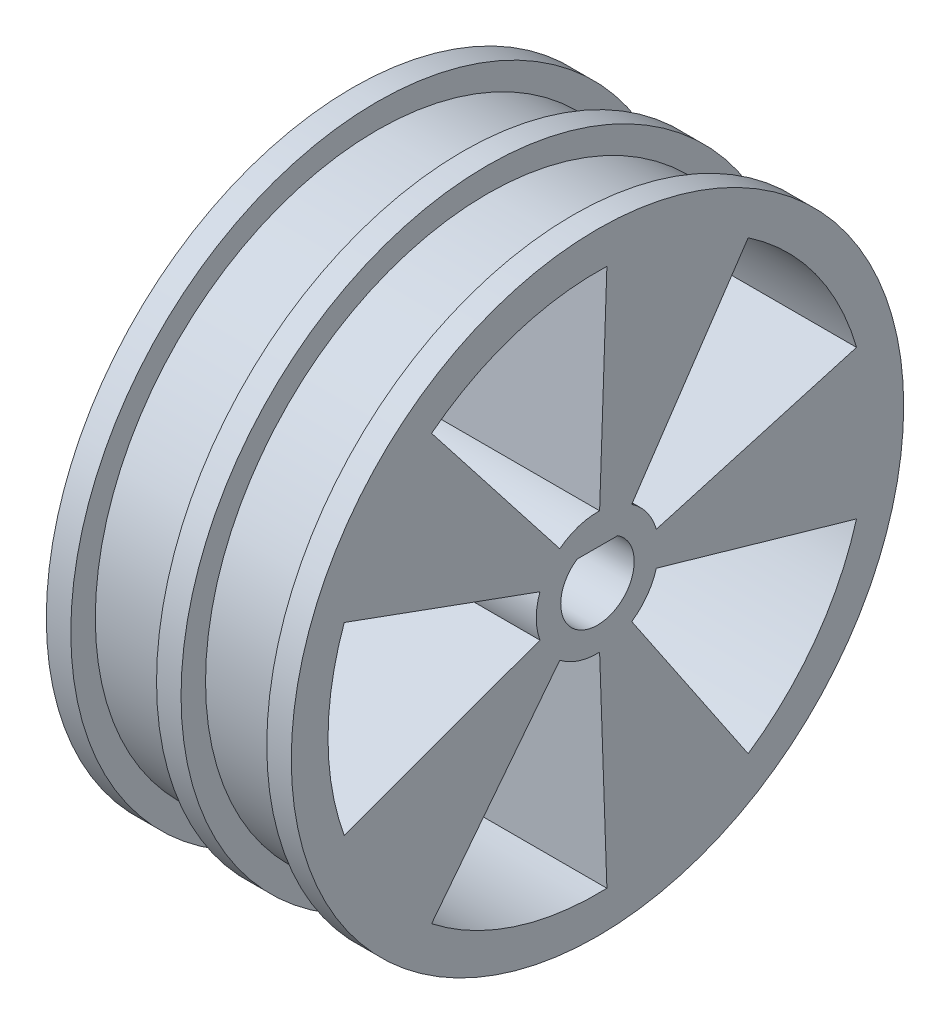
ISO-10303-21;
HEADER;
FILE_DESCRIPTION(('STEP AP214'),'2;1');
FILE_NAME('part.step','',(''),(''),'','','');
FILE_SCHEMA(('AUTOMOTIVE_DESIGN { 1 0 10303 214 1 1 1 1 }'));
ENDSEC;
DATA;
#1=APPLICATION_CONTEXT('core data for automotive mechanical design processes');
#2=APPLICATION_PROTOCOL_DEFINITION('international standard','automotive_design',2000,#1);
#3=PRODUCT_CONTEXT('',#1,'mechanical');
#4=PRODUCT('Part','Part','',(#3));
#5=PRODUCT_RELATED_PRODUCT_CATEGORY('part','',(#4));
#6=PRODUCT_DEFINITION_FORMATION('','',#4);
#7=PRODUCT_DEFINITION_CONTEXT('part definition',#1,'design');
#8=PRODUCT_DEFINITION('design','',#6,#7);
#9=PRODUCT_DEFINITION_SHAPE('','',#8);
#10=(LENGTH_UNIT() NAMED_UNIT(*) SI_UNIT(.MILLI.,.METRE.));
#11=(NAMED_UNIT(*) PLANE_ANGLE_UNIT() SI_UNIT($,.RADIAN.));
#12=(NAMED_UNIT(*) SI_UNIT($,.STERADIAN.) SOLID_ANGLE_UNIT());
#13=UNCERTAINTY_MEASURE_WITH_UNIT(LENGTH_MEASURE(1.E-05),#10,'distance_accuracy_value','');
#14=(GEOMETRIC_REPRESENTATION_CONTEXT(3) GLOBAL_UNCERTAINTY_ASSIGNED_CONTEXT((#13)) GLOBAL_UNIT_ASSIGNED_CONTEXT((#10,
#11,#12)) REPRESENTATION_CONTEXT('',''));
#15=CARTESIAN_POINT('',(0.,0.,0.));
#16=DIRECTION('',(0.,0.,1.));
#17=DIRECTION('',(1.,0.,0.));
#18=AXIS2_PLACEMENT_3D('',#15,#16,#17);
#19=CARTESIAN_POINT('',(-10.,2.5,1.6583123951777));
#20=DIRECTION('',(0.,1.,0.));
#21=DIRECTION('',(0.,0.,1.));
#22=AXIS2_PLACEMENT_3D('',#19,#20,#21);
#23=PLANE('',#22);
#24=DIRECTION('',(0.,0.,1.));
#25=VECTOR('',#24,1.);
#26=CARTESIAN_POINT('',(-6.,2.5,1.6583123951777));
#27=LINE('',#26,#25);
#28=CARTESIAN_POINT('',(-6.,2.5,-1.6583123951777));
#29=VERTEX_POINT('',#28);
#30=CARTESIAN_POINT('',(-6.,2.5,1.6583123951777));
#31=VERTEX_POINT('',#30);
#32=EDGE_CURVE('E12',#29,#31,#27,.T.);
#33=ORIENTED_EDGE('',*,*,#32,.F.);
#34=DIRECTION('',(1.,0.,0.));
#35=VECTOR('',#34,1.);
#36=CARTESIAN_POINT('',(-10.,2.5,-1.6583123951777));
#37=LINE('',#36,#35);
#38=CARTESIAN_POINT('',(10.,2.5,-1.6583123951777));
#39=VERTEX_POINT('',#38);
#40=EDGE_CURVE('E235',#29,#39,#37,.T.);
#41=ORIENTED_EDGE('',*,*,#40,.T.);
#42=DIRECTION('',(0.,0.,1.));
#43=VECTOR('',#42,1.);
#44=CARTESIAN_POINT('',(10.,2.5,1.6583123951777));
#45=LINE('',#44,#43);
#46=CARTESIAN_POINT('',(10.,2.5,1.6583123951777));
#47=VERTEX_POINT('',#46);
#48=EDGE_CURVE('E239',#39,#47,#45,.T.);
#49=ORIENTED_EDGE('',*,*,#48,.T.);
#50=DIRECTION('',(1.,0.,0.));
#51=VECTOR('',#50,1.);
#52=CARTESIAN_POINT('',(-10.,2.5,1.6583123951777));
#53=LINE('',#52,#51);
#54=EDGE_CURVE('E233',#31,#47,#53,.T.);
#55=ORIENTED_EDGE('',*,*,#54,.F.);
#56=EDGE_LOOP('',(#33,#41,#49,#55));
#57=FACE_BOUND('',#56,.T.);
#58=ADVANCED_FACE('F80',(#57),#23,.F.);
#59=CARTESIAN_POINT('',(-10.,0.,0.));
#60=DIRECTION('',(1.,0.,0.));
#61=DIRECTION('',(0.,0.,-1.));
#62=AXIS2_PLACEMENT_3D('',#59,#60,#61);
#63=PLANE('',#62);
#64=CARTESIAN_POINT('',(-10.,0.,0.));
#65=DIRECTION('',(1.,0.,0.));
#66=DIRECTION('',(0.,0.,-1.));
#67=AXIS2_PLACEMENT_3D('',#64,#65,#66);
#68=CIRCLE('',#67,5.);
#69=CARTESIAN_POINT('',(-10.,-4.99695413509548,-0.174497483512452));
#70=VERTEX_POINT('',#69);
#71=CARTESIAN_POINT('',(-10.,-3.94005376803357,3.07830737662834));
#72=VERTEX_POINT('',#71);
#73=EDGE_CURVE('E420',#70,#72,#68,.F.);
#74=ORIENTED_EDGE('',*,*,#73,.T.);
#75=DIRECTION('',(0.,0.788010753606723,-0.615661475325657));
#76=VECTOR('',#75,1.);
#77=CARTESIAN_POINT('',(-10.,0.,0.));
#78=LINE('',#77,#76);
#79=CARTESIAN_POINT('',(-10.,-17.3362365793479,13.5445524571645));
#80=VERTEX_POINT('',#79);
#81=EDGE_CURVE('E400',#80,#72,#78,.T.);
#82=ORIENTED_EDGE('',*,*,#81,.F.);
#83=CARTESIAN_POINT('',(-10.,0.,0.));
#84=DIRECTION('',(1.,0.,0.));
#85=DIRECTION('',(0.,0.,-1.));
#86=AXIS2_PLACEMENT_3D('',#83,#84,#85);
#87=CIRCLE('',#86,22.);
#88=CARTESIAN_POINT('',(-10.,-21.9865981944201,-0.767788927455052));
#89=VERTEX_POINT('',#88);
#90=EDGE_CURVE('E392',#89,#80,#87,.F.);
#91=ORIENTED_EDGE('',*,*,#90,.F.);
#92=DIRECTION('',(0.,0.999390827019096,0.0348994967025059));
#93=VECTOR('',#92,1.);
#94=CARTESIAN_POINT('',(-10.,0.,0.));
#95=LINE('',#94,#93);
#96=EDGE_CURVE('E410',#89,#70,#95,.T.);
#97=ORIENTED_EDGE('',*,*,#96,.T.);
#98=EDGE_LOOP('',(#74,#82,#91,#97));
#99=FACE_BOUND('',#98,.T.);
#100=CARTESIAN_POINT('',(-10.,0.,0.));
#101=DIRECTION('',(1.,0.,0.));
#102=DIRECTION('',(0.,0.,-1.));
#103=AXIS2_PLACEMENT_3D('',#100,#101,#102);
#104=CIRCLE('',#103,5.);
#105=CARTESIAN_POINT('',(-10.,-1.37818677908506,-4.8063084796917));
#106=VERTEX_POINT('',#105);
#107=CARTESIAN_POINT('',(-10.,-4.14518786277518,-2.79596451735377));
#108=VERTEX_POINT('',#107);
#109=EDGE_CURVE('E394',#106,#108,#104,.F.);
#110=ORIENTED_EDGE('',*,*,#109,.T.);
#111=DIRECTION('',(0.,0.829037572555044,0.559192903470743));
#112=VECTOR('',#111,1.);
#113=CARTESIAN_POINT('',(-10.,0.,0.));
#114=LINE('',#113,#112);
#115=CARTESIAN_POINT('',(-10.,-18.2388265962109,-12.3022438763564));
#116=VERTEX_POINT('',#115);
#117=EDGE_CURVE('E370',#116,#108,#114,.T.);
#118=ORIENTED_EDGE('',*,*,#117,.F.);
#119=CARTESIAN_POINT('',(-10.,0.,0.));
#120=DIRECTION('',(1.,0.,0.));
#121=DIRECTION('',(0.,0.,-1.));
#122=AXIS2_PLACEMENT_3D('',#119,#120,#121);
#123=CIRCLE('',#122,22.);
#124=CARTESIAN_POINT('',(-10.,-6.06402182797396,-21.147757310643));
#125=VERTEX_POINT('',#124);
#126=EDGE_CURVE('E362',#125,#116,#123,.F.);
#127=ORIENTED_EDGE('',*,*,#126,.F.);
#128=DIRECTION('',(0.,0.275637355816996,0.96126169593832));
#129=VECTOR('',#128,1.);
#130=CARTESIAN_POINT('',(-10.,0.,0.));
#131=LINE('',#130,#129);
#132=EDGE_CURVE('E381',#125,#106,#131,.T.);
#133=ORIENTED_EDGE('',*,*,#132,.T.);
#134=EDGE_LOOP('',(#110,#118,#127,#133));
#135=FACE_BOUND('',#134,.T.);
#136=CARTESIAN_POINT('',(-10.,0.,0.));
#137=DIRECTION('',(1.,0.,0.));
#138=DIRECTION('',(0.,0.,-1.));
#139=AXIS2_PLACEMENT_3D('',#136,#137,#138);
#140=CIRCLE('',#139,5.);
#141=CARTESIAN_POINT('',(-10.,4.14518786277522,-2.79596451735385));
#142=VERTEX_POINT('',#141);
#143=CARTESIAN_POINT('',(-10.,1.37818677908497,-4.8063084796916));
#144=VERTEX_POINT('',#143);
#145=EDGE_CURVE('E364',#142,#144,#140,.F.);
#146=ORIENTED_EDGE('',*,*,#145,.T.);
#147=DIRECTION('',(0.,-0.275637355816999,0.961261695938319));
#148=VECTOR('',#147,1.);
#149=CARTESIAN_POINT('',(-10.,0.,0.));
#150=LINE('',#149,#148);
#151=CARTESIAN_POINT('',(-10.,6.06402182797396,-21.147757310643));
#152=VERTEX_POINT('',#151);
#153=EDGE_CURVE('E340',#152,#144,#150,.T.);
#154=ORIENTED_EDGE('',*,*,#153,.F.);
#155=CARTESIAN_POINT('',(-10.,0.,0.));
#156=DIRECTION('',(1.,0.,0.));
#157=DIRECTION('',(0.,0.,-1.));
#158=AXIS2_PLACEMENT_3D('',#155,#156,#157);
#159=CIRCLE('',#158,22.);
#160=CARTESIAN_POINT('',(-10.,18.2388265962109,-12.3022438763564));
#161=VERTEX_POINT('',#160);
#162=EDGE_CURVE('E332',#161,#152,#159,.F.);
#163=ORIENTED_EDGE('',*,*,#162,.F.);
#164=DIRECTION('',(0.,-0.829037572555046,0.559192903470741));
#165=VECTOR('',#164,1.);
#166=CARTESIAN_POINT('',(-10.,0.,-1.04985018589199E-13));
#167=LINE('',#166,#165);
#168=EDGE_CURVE('E351',#161,#142,#167,.T.);
#169=ORIENTED_EDGE('',*,*,#168,.T.);
#170=EDGE_LOOP('',(#146,#154,#163,#169));
#171=FACE_BOUND('',#170,.T.);
#172=CARTESIAN_POINT('',(-10.,0.,0.));
#173=DIRECTION('',(1.,0.,0.));
#174=DIRECTION('',(0.,0.,-1.));
#175=AXIS2_PLACEMENT_3D('',#172,#173,#174);
#176=CIRCLE('',#175,5.);
#177=CARTESIAN_POINT('',(-10.,3.9400537680336,3.0783073766283));
#178=VERTEX_POINT('',#177);
#179=CARTESIAN_POINT('',(-10.,4.99695413509548,-0.174497483512522));
#180=VERTEX_POINT('',#179);
#181=EDGE_CURVE('E334',#178,#180,#176,.F.);
#182=ORIENTED_EDGE('',*,*,#181,.T.);
#183=DIRECTION('',(0.,-0.999390827019096,0.0348994967025015));
#184=VECTOR('',#183,1.);
#185=CARTESIAN_POINT('',(-10.,0.,0.));
#186=LINE('',#185,#184);
#187=CARTESIAN_POINT('',(-10.,21.9865981944201,-0.767788927455048));
#188=VERTEX_POINT('',#187);
#189=EDGE_CURVE('E310',#188,#180,#186,.T.);
#190=ORIENTED_EDGE('',*,*,#189,.F.);
#191=CARTESIAN_POINT('',(-10.,0.,0.));
#192=DIRECTION('',(1.,0.,0.));
#193=DIRECTION('',(0.,0.,-1.));
#194=AXIS2_PLACEMENT_3D('',#191,#192,#193);
#195=CIRCLE('',#194,22.);
#196=CARTESIAN_POINT('',(-10.,17.3362365793479,13.5445524571645));
#197=VERTEX_POINT('',#196);
#198=EDGE_CURVE('E303',#197,#188,#195,.F.);
#199=ORIENTED_EDGE('',*,*,#198,.F.);
#200=DIRECTION('',(0.,-0.788010753606721,-0.615661475325659));
#201=VECTOR('',#200,1.);
#202=CARTESIAN_POINT('',(-10.,0.,0.));
#203=LINE('',#202,#201);
#204=EDGE_CURVE('E321',#197,#178,#203,.T.);
#205=ORIENTED_EDGE('',*,*,#204,.T.);
#206=EDGE_LOOP('',(#182,#190,#199,#205));
#207=FACE_BOUND('',#206,.T.);
#208=CARTESIAN_POINT('',(-10.,0.,0.));
#209=DIRECTION('',(1.,0.,0.));
#210=DIRECTION('',(0.,0.,-1.));
#211=AXIS2_PLACEMENT_3D('',#208,#209,#210);
#212=CIRCLE('',#211,25.);
#213=CARTESIAN_POINT('',(-10.,0.,-25.));
#214=VERTEX_POINT('',#213);
#215=EDGE_CURVE('E88',#214,#214,#212,.T.);
#216=ORIENTED_EDGE('',*,*,#215,.F.);
#217=EDGE_LOOP('',(#216));
#218=FACE_BOUND('',#217,.T.);
#219=CARTESIAN_POINT('',(-10.,0.,0.));
#220=DIRECTION('',(1.,0.,0.));
#221=DIRECTION('',(0.,0.,-1.));
#222=AXIS2_PLACEMENT_3D('',#219,#220,#221);
#223=CIRCLE('',#222,3.);
#224=CARTESIAN_POINT('',(-10.,0.,-3.));
#225=VERTEX_POINT('',#224);
#226=EDGE_CURVE('E243',#225,#225,#223,.T.);
#227=ORIENTED_EDGE('',*,*,#226,.T.);
#228=EDGE_LOOP('',(#227));
#229=FACE_BOUND('',#228,.T.);
#230=DIRECTION('',(0.,0.34202014332567,-0.939692620785908));
#231=VECTOR('',#230,1.);
#232=CARTESIAN_POINT('',(-10.,0.,0.));
#233=LINE('',#232,#231);
#234=CARTESIAN_POINT('',(-10.,-7.52444315316474,20.67323765729));
#235=VERTEX_POINT('',#234);
#236=CARTESIAN_POINT('',(-10.,-1.71010071662835,4.69846310392954));
#237=VERTEX_POINT('',#236);
#238=EDGE_CURVE('E279',#235,#237,#233,.T.);
#239=ORIENTED_EDGE('',*,*,#238,.T.);
#240=CARTESIAN_POINT('',(-10.,0.,0.));
#241=DIRECTION('',(1.,0.,0.));
#242=DIRECTION('',(0.,0.,-1.));
#243=AXIS2_PLACEMENT_3D('',#240,#241,#242);
#244=CIRCLE('',#243,5.);
#245=CARTESIAN_POINT('',(-10.,1.71010071662835,4.69846310392954));
#246=VERTEX_POINT('',#245);
#247=EDGE_CURVE('E282',#237,#246,#244,.F.);
#248=ORIENTED_EDGE('',*,*,#247,.T.);
#249=DIRECTION('',(0.,-0.34202014332567,-0.939692620785908));
#250=VECTOR('',#249,1.);
#251=CARTESIAN_POINT('',(-10.,0.,0.));
#252=LINE('',#251,#250);
#253=CARTESIAN_POINT('',(-10.,7.52444315316474,20.67323765729));
#254=VERTEX_POINT('',#253);
#255=EDGE_CURVE('E305',#254,#246,#252,.T.);
#256=ORIENTED_EDGE('',*,*,#255,.F.);
#257=CARTESIAN_POINT('',(-10.,0.,0.));
#258=DIRECTION('',(1.,0.,0.));
#259=DIRECTION('',(0.,0.,-1.));
#260=AXIS2_PLACEMENT_3D('',#257,#258,#259);
#261=CIRCLE('',#260,22.);
#262=EDGE_CURVE('E276',#235,#254,#261,.F.);
#263=ORIENTED_EDGE('',*,*,#262,.F.);
#264=EDGE_LOOP('',(#239,#248,#256,#263));
#265=FACE_BOUND('',#264,.T.);
#266=ADVANCED_FACE('F426',(#99,#135,#171,#207,#218,#229,#265),#63,.F.);
#267=CARTESIAN_POINT('',(10.,0.,0.));
#268=DIRECTION('',(1.,0.,0.));
#269=DIRECTION('',(0.,0.,-1.));
#270=AXIS2_PLACEMENT_3D('',#267,#268,#269);
#271=PLANE('',#270);
#272=DIRECTION('',(0.,-0.788010753606723,0.615661475325657));
#273=VECTOR('',#272,1.);
#274=CARTESIAN_POINT('',(10.,0.,0.));
#275=LINE('',#274,#273);
#276=CARTESIAN_POINT('',(10.,-3.94005376803357,3.07830737662834));
#277=VERTEX_POINT('',#276);
#278=CARTESIAN_POINT('',(10.,-17.3362365793479,13.5445524571645));
#279=VERTEX_POINT('',#278);
#280=EDGE_CURVE('E236',#277,#279,#275,.T.);
#281=ORIENTED_EDGE('',*,*,#280,.F.);
#282=CARTESIAN_POINT('',(10.,0.,0.));
#283=DIRECTION('',(1.,0.,0.));
#284=DIRECTION('',(0.,0.,-1.));
#285=AXIS2_PLACEMENT_3D('',#282,#283,#284);
#286=CIRCLE('',#285,5.);
#287=CARTESIAN_POINT('',(10.,-4.99695413509548,-0.174497483512452));
#288=VERTEX_POINT('',#287);
#289=EDGE_CURVE('E404',#277,#288,#286,.T.);
#290=ORIENTED_EDGE('',*,*,#289,.T.);
#291=DIRECTION('',(0.,-0.999390827019096,-0.0348994967025059));
#292=VECTOR('',#291,1.);
#293=CARTESIAN_POINT('',(10.,0.,0.));
#294=LINE('',#293,#292);
#295=CARTESIAN_POINT('',(10.,-21.9865981944201,-0.767788927455052));
#296=VERTEX_POINT('',#295);
#297=EDGE_CURVE('E413',#288,#296,#294,.T.);
#298=ORIENTED_EDGE('',*,*,#297,.T.);
#299=CARTESIAN_POINT('',(10.,0.,0.));
#300=DIRECTION('',(1.,0.,0.));
#301=DIRECTION('',(0.,0.,-1.));
#302=AXIS2_PLACEMENT_3D('',#299,#300,#301);
#303=CIRCLE('',#302,22.);
#304=EDGE_CURVE('E416',#279,#296,#303,.T.);
#305=ORIENTED_EDGE('',*,*,#304,.F.);
#306=EDGE_LOOP('',(#281,#290,#298,#305));
#307=FACE_BOUND('',#306,.T.);
#308=DIRECTION('',(0.,-0.829037572555044,-0.559192903470743));
#309=VECTOR('',#308,1.);
#310=CARTESIAN_POINT('',(10.,0.,0.));
#311=LINE('',#310,#309);
#312=CARTESIAN_POINT('',(10.,-4.14518786277528,-2.79596451735384));
#313=VERTEX_POINT('',#312);
#314=CARTESIAN_POINT('',(10.,-18.2388265962109,-12.3022438763564));
#315=VERTEX_POINT('',#314);
#316=EDGE_CURVE('E390',#313,#315,#311,.T.);
#317=ORIENTED_EDGE('',*,*,#316,.F.);
#318=CARTESIAN_POINT('',(10.,0.,0.));
#319=DIRECTION('',(1.,0.,0.));
#320=DIRECTION('',(0.,0.,-1.));
#321=AXIS2_PLACEMENT_3D('',#318,#319,#320);
#322=CIRCLE('',#321,5.);
#323=CARTESIAN_POINT('',(10.,-1.37818677908506,-4.8063084796917));
#324=VERTEX_POINT('',#323);
#325=EDGE_CURVE('E375',#313,#324,#322,.T.);
#326=ORIENTED_EDGE('',*,*,#325,.T.);
#327=DIRECTION('',(0.,-0.275637355816996,-0.96126169593832));
#328=VECTOR('',#327,1.);
#329=CARTESIAN_POINT('',(10.,0.,0.));
#330=LINE('',#329,#328);
#331=CARTESIAN_POINT('',(10.,-6.06402182797396,-21.147757310643));
#332=VERTEX_POINT('',#331);
#333=EDGE_CURVE('E384',#324,#332,#330,.T.);
#334=ORIENTED_EDGE('',*,*,#333,.T.);
#335=CARTESIAN_POINT('',(10.,0.,0.));
#336=DIRECTION('',(1.,0.,0.));
#337=DIRECTION('',(0.,0.,-1.));
#338=AXIS2_PLACEMENT_3D('',#335,#336,#337);
#339=CIRCLE('',#338,22.);
#340=EDGE_CURVE('E387',#315,#332,#339,.T.);
#341=ORIENTED_EDGE('',*,*,#340,.F.);
#342=EDGE_LOOP('',(#317,#326,#334,#341));
#343=FACE_BOUND('',#342,.T.);
#344=DIRECTION('',(0.,0.275637355816999,-0.961261695938319));
#345=VECTOR('',#344,1.);
#346=CARTESIAN_POINT('',(10.,0.,0.));
#347=LINE('',#346,#345);
#348=CARTESIAN_POINT('',(10.,1.378186779085,-4.80630847969172));
#349=VERTEX_POINT('',#348);
#350=CARTESIAN_POINT('',(10.,6.06402182797396,-21.147757310643));
#351=VERTEX_POINT('',#350);
#352=EDGE_CURVE('E360',#349,#351,#347,.T.);
#353=ORIENTED_EDGE('',*,*,#352,.F.);
#354=CARTESIAN_POINT('',(10.,0.,0.));
#355=DIRECTION('',(1.,0.,0.));
#356=DIRECTION('',(0.,0.,-1.));
#357=AXIS2_PLACEMENT_3D('',#354,#355,#356);
#358=CIRCLE('',#357,5.);
#359=CARTESIAN_POINT('',(10.,4.14518786277522,-2.79596451735385));
#360=VERTEX_POINT('',#359);
#361=EDGE_CURVE('E345',#349,#360,#358,.T.);
#362=ORIENTED_EDGE('',*,*,#361,.T.);
#363=DIRECTION('',(0.,0.829037572555046,-0.559192903470741));
#364=VECTOR('',#363,1.);
#365=CARTESIAN_POINT('',(10.,0.,-1.04985018589199E-13));
#366=LINE('',#365,#364);
#367=CARTESIAN_POINT('',(10.,18.2388265962109,-12.3022438763564));
#368=VERTEX_POINT('',#367);
#369=EDGE_CURVE('E354',#360,#368,#366,.T.);
#370=ORIENTED_EDGE('',*,*,#369,.T.);
#371=CARTESIAN_POINT('',(10.,0.,0.));
#372=DIRECTION('',(1.,0.,0.));
#373=DIRECTION('',(0.,0.,-1.));
#374=AXIS2_PLACEMENT_3D('',#371,#372,#373);
#375=CIRCLE('',#374,22.);
#376=EDGE_CURVE('E357',#351,#368,#375,.T.);
#377=ORIENTED_EDGE('',*,*,#376,.F.);
#378=EDGE_LOOP('',(#353,#362,#370,#377));
#379=FACE_BOUND('',#378,.T.);
#380=DIRECTION('',(0.,0.999390827019096,-0.0348994967025015));
#381=VECTOR('',#380,1.);
#382=CARTESIAN_POINT('',(10.,0.,0.));
#383=LINE('',#382,#381);
#384=CARTESIAN_POINT('',(10.,4.99695413509548,-0.174497483512522));
#385=VERTEX_POINT('',#384);
#386=CARTESIAN_POINT('',(10.,21.9865981944201,-0.767788927455049));
#387=VERTEX_POINT('',#386);
#388=EDGE_CURVE('E330',#385,#387,#383,.T.);
#389=ORIENTED_EDGE('',*,*,#388,.F.);
#390=CARTESIAN_POINT('',(10.,0.,0.));
#391=DIRECTION('',(1.,0.,0.));
#392=DIRECTION('',(0.,0.,-1.));
#393=AXIS2_PLACEMENT_3D('',#390,#391,#392);
#394=CIRCLE('',#393,5.);
#395=CARTESIAN_POINT('',(10.,3.9400537680336,3.0783073766283));
#396=VERTEX_POINT('',#395);
#397=EDGE_CURVE('E315',#385,#396,#394,.T.);
#398=ORIENTED_EDGE('',*,*,#397,.T.);
#399=DIRECTION('',(0.,0.788010753606721,0.615661475325659));
#400=VECTOR('',#399,1.);
#401=CARTESIAN_POINT('',(10.,0.,0.));
#402=LINE('',#401,#400);
#403=CARTESIAN_POINT('',(10.,17.3362365793479,13.5445524571645));
#404=VERTEX_POINT('',#403);
#405=EDGE_CURVE('E324',#396,#404,#402,.T.);
#406=ORIENTED_EDGE('',*,*,#405,.T.);
#407=CARTESIAN_POINT('',(10.,0.,0.));
#408=DIRECTION('',(1.,0.,0.));
#409=DIRECTION('',(0.,0.,-1.));
#410=AXIS2_PLACEMENT_3D('',#407,#408,#409);
#411=CIRCLE('',#410,22.);
#412=EDGE_CURVE('E327',#387,#404,#411,.T.);
#413=ORIENTED_EDGE('',*,*,#412,.F.);
#414=EDGE_LOOP('',(#389,#398,#406,#413));
#415=FACE_BOUND('',#414,.T.);
#416=ORIENTED_EDGE('',*,*,#48,.F.);
#417=CARTESIAN_POINT('',(10.,0.,0.));
#418=DIRECTION('',(1.,0.,0.));
#419=DIRECTION('',(0.,0.,-1.));
#420=AXIS2_PLACEMENT_3D('',#417,#418,#419);
#421=CIRCLE('',#420,3.);
#422=EDGE_CURVE('E252',#47,#39,#421,.T.);
#423=ORIENTED_EDGE('',*,*,#422,.F.);
#424=EDGE_LOOP('',(#416,#423));
#425=FACE_BOUND('',#424,.T.);
#426=CARTESIAN_POINT('',(10.,0.,0.));
#427=DIRECTION('',(1.,0.,0.));
#428=DIRECTION('',(0.,0.,-1.));
#429=AXIS2_PLACEMENT_3D('',#426,#427,#428);
#430=CIRCLE('',#429,25.);
#431=CARTESIAN_POINT('',(10.,0.,-25.));
#432=VERTEX_POINT('',#431);
#433=EDGE_CURVE('E248',#432,#432,#430,.T.);
#434=ORIENTED_EDGE('',*,*,#433,.T.);
#435=EDGE_LOOP('',(#434));
#436=FACE_BOUND('',#435,.T.);
#437=CARTESIAN_POINT('',(10.,0.,0.));
#438=DIRECTION('',(1.,0.,0.));
#439=DIRECTION('',(0.,0.,-1.));
#440=AXIS2_PLACEMENT_3D('',#437,#438,#439);
#441=CIRCLE('',#440,5.);
#442=CARTESIAN_POINT('',(10.,1.71010071662835,4.69846310392954));
#443=VERTEX_POINT('',#442);
#444=CARTESIAN_POINT('',(10.,-1.71010071662835,4.69846310392954));
#445=VERTEX_POINT('',#444);
#446=EDGE_CURVE('E294',#443,#445,#441,.T.);
#447=ORIENTED_EDGE('',*,*,#446,.T.);
#448=DIRECTION('',(0.,-0.34202014332567,0.939692620785908));
#449=VECTOR('',#448,1.);
#450=CARTESIAN_POINT('',(10.,0.,0.));
#451=LINE('',#450,#449);
#452=CARTESIAN_POINT('',(10.,-7.52444315316474,20.67323765729));
#453=VERTEX_POINT('',#452);
#454=EDGE_CURVE('E297',#445,#453,#451,.T.);
#455=ORIENTED_EDGE('',*,*,#454,.T.);
#456=CARTESIAN_POINT('',(10.,0.,0.));
#457=DIRECTION('',(1.,0.,0.));
#458=DIRECTION('',(0.,0.,-1.));
#459=AXIS2_PLACEMENT_3D('',#456,#457,#458);
#460=CIRCLE('',#459,22.);
#461=CARTESIAN_POINT('',(10.,7.52444315316474,20.67323765729));
#462=VERTEX_POINT('',#461);
#463=EDGE_CURVE('E300',#462,#453,#460,.T.);
#464=ORIENTED_EDGE('',*,*,#463,.F.);
#465=DIRECTION('',(0.,0.34202014332567,0.939692620785908));
#466=VECTOR('',#465,1.);
#467=CARTESIAN_POINT('',(10.,0.,0.));
#468=LINE('',#467,#466);
#469=EDGE_CURVE('E287',#443,#462,#468,.T.);
#470=ORIENTED_EDGE('',*,*,#469,.F.);
#471=EDGE_LOOP('',(#447,#455,#464,#470));
#472=FACE_BOUND('',#471,.T.);
#473=ADVANCED_FACE('F444',(#307,#343,#379,#415,#425,#436,#472),#271,.T.);
#474=CARTESIAN_POINT('',(-10.,0.,0.));
#475=DIRECTION('',(1.,0.,0.));
#476=DIRECTION('',(0.,0.,-1.));
#477=AXIS2_PLACEMENT_3D('',#474,#475,#476);
#478=CYLINDRICAL_SURFACE('',#477,25.);
#479=CARTESIAN_POINT('',(-1.,0.,0.));
#480=DIRECTION('',(-1.,0.,0.));
#481=DIRECTION('',(0.,0.,1.));
#482=AXIS2_PLACEMENT_3D('',#479,#480,#481);
#483=CIRCLE('',#482,25.);
#484=CARTESIAN_POINT('',(-1.,0.,25.));
#485=VERTEX_POINT('',#484);
#486=EDGE_CURVE('E254',#485,#485,#483,.T.);
#487=ORIENTED_EDGE('',*,*,#486,.F.);
#488=EDGE_LOOP('',(#487));
#489=FACE_BOUND('',#488,.T.);
#490=CARTESIAN_POINT('',(1.,0.,0.));
#491=DIRECTION('',(-1.,0.,0.));
#492=DIRECTION('',(0.,0.,1.));
#493=AXIS2_PLACEMENT_3D('',#490,#491,#492);
#494=CIRCLE('',#493,25.);
#495=CARTESIAN_POINT('',(1.,0.,25.));
#496=VERTEX_POINT('',#495);
#497=EDGE_CURVE('E264',#496,#496,#494,.T.);
#498=ORIENTED_EDGE('',*,*,#497,.T.);
#499=EDGE_LOOP('',(#498));
#500=FACE_BOUND('',#499,.T.);
#501=ADVANCED_FACE('F447',(#489,#500),#478,.T.);
#502=CARTESIAN_POINT('',(8.,0.,0.));
#503=DIRECTION('',(-1.,0.,0.));
#504=DIRECTION('',(0.,0.,1.));
#505=AXIS2_PLACEMENT_3D('',#502,#503,#504);
#506=CIRCLE('',#505,25.);
#507=CARTESIAN_POINT('',(8.,0.,25.));
#508=VERTEX_POINT('',#507);
#509=EDGE_CURVE('E267',#508,#508,#506,.T.);
#510=ORIENTED_EDGE('',*,*,#509,.F.);
#511=EDGE_LOOP('',(#510));
#512=FACE_BOUND('',#511,.T.);
#513=ORIENTED_EDGE('',*,*,#433,.F.);
#514=EDGE_LOOP('',(#513));
#515=FACE_BOUND('',#514,.T.);
#516=ADVANCED_FACE('F697',(#512,#515),#478,.T.);
#517=CARTESIAN_POINT('',(-8.,0.,0.));
#518=DIRECTION('',(-1.,0.,0.));
#519=DIRECTION('',(0.,0.,1.));
#520=AXIS2_PLACEMENT_3D('',#517,#518,#519);
#521=CIRCLE('',#520,25.);
#522=CARTESIAN_POINT('',(-8.,0.,25.));
#523=VERTEX_POINT('',#522);
#524=EDGE_CURVE('E255',#523,#523,#521,.T.);
#525=ORIENTED_EDGE('',*,*,#524,.T.);
#526=EDGE_LOOP('',(#525));
#527=FACE_BOUND('',#526,.T.);
#528=ORIENTED_EDGE('',*,*,#215,.T.);
#529=EDGE_LOOP('',(#528));
#530=FACE_BOUND('',#529,.T.);
#531=ADVANCED_FACE('F82',(#527,#530),#478,.T.);
#532=CARTESIAN_POINT('',(-10.,0.,0.));
#533=DIRECTION('',(1.,0.,0.));
#534=DIRECTION('',(0.,0.,-1.));
#535=AXIS2_PLACEMENT_3D('',#532,#533,#534);
#536=CYLINDRICAL_SURFACE('',#535,3.);
#537=CARTESIAN_POINT('',(-6.,0.,0.));
#538=DIRECTION('',(-1.,0.,0.));
#539=DIRECTION('',(0.,0.,1.));
#540=AXIS2_PLACEMENT_3D('',#537,#538,#539);
#541=CIRCLE('',#540,3.);
#542=EDGE_CURVE('E93',#31,#29,#541,.T.);
#543=ORIENTED_EDGE('',*,*,#542,.F.);
#544=ORIENTED_EDGE('',*,*,#54,.T.);
#545=ORIENTED_EDGE('',*,*,#422,.T.);
#546=ORIENTED_EDGE('',*,*,#40,.F.);
#547=EDGE_LOOP('',(#543,#544,#545,#546));
#548=FACE_BOUND('',#547,.T.);
#549=ORIENTED_EDGE('',*,*,#226,.F.);
#550=EDGE_LOOP('',(#549));
#551=FACE_BOUND('',#550,.T.);
#552=ADVANCED_FACE('F230',(#548,#551),#536,.F.);
#553=CARTESIAN_POINT('',(-1.,0.,0.));
#554=DIRECTION('',(-1.,0.,0.));
#555=DIRECTION('',(0.,0.,1.));
#556=AXIS2_PLACEMENT_3D('',#553,#554,#555);
#557=PLANE('',#556);
#558=CARTESIAN_POINT('',(-1.,0.,0.));
#559=DIRECTION('',(-1.,0.,0.));
#560=DIRECTION('',(0.,0.,1.));
#561=AXIS2_PLACEMENT_3D('',#558,#559,#560);
#562=CIRCLE('',#561,23.);
#563=CARTESIAN_POINT('',(-1.,0.,23.));
#564=VERTEX_POINT('',#563);
#565=EDGE_CURVE('E258',#564,#564,#562,.T.);
#566=ORIENTED_EDGE('',*,*,#565,.F.);
#567=EDGE_LOOP('',(#566));
#568=FACE_BOUND('',#567,.T.);
#569=ORIENTED_EDGE('',*,*,#486,.T.);
#570=EDGE_LOOP('',(#569));
#571=FACE_BOUND('',#570,.T.);
#572=ADVANCED_FACE('F487',(#568,#571),#557,.T.);
#573=CARTESIAN_POINT('',(-8.,0.,0.));
#574=DIRECTION('',(-1.,0.,0.));
#575=DIRECTION('',(0.,0.,1.));
#576=AXIS2_PLACEMENT_3D('',#573,#574,#575);
#577=PLANE('',#576);
#578=CARTESIAN_POINT('',(-8.,0.,0.));
#579=DIRECTION('',(-1.,0.,0.));
#580=DIRECTION('',(0.,0.,1.));
#581=AXIS2_PLACEMENT_3D('',#578,#579,#580);
#582=CIRCLE('',#581,23.);
#583=CARTESIAN_POINT('',(-8.,0.,23.));
#584=VERTEX_POINT('',#583);
#585=EDGE_CURVE('E261',#584,#584,#582,.T.);
#586=ORIENTED_EDGE('',*,*,#585,.T.);
#587=EDGE_LOOP('',(#586));
#588=FACE_BOUND('',#587,.T.);
#589=ORIENTED_EDGE('',*,*,#524,.F.);
#590=EDGE_LOOP('',(#589));
#591=FACE_BOUND('',#590,.T.);
#592=ADVANCED_FACE('F489',(#588,#591),#577,.F.);
#593=CARTESIAN_POINT('',(-1.,0.,0.));
#594=DIRECTION('',(-1.,0.,0.));
#595=DIRECTION('',(0.,0.,1.));
#596=AXIS2_PLACEMENT_3D('',#593,#594,#595);
#597=CYLINDRICAL_SURFACE('',#596,23.);
#598=ORIENTED_EDGE('',*,*,#565,.T.);
#599=EDGE_LOOP('',(#598));
#600=FACE_BOUND('',#599,.T.);
#601=ORIENTED_EDGE('',*,*,#585,.F.);
#602=EDGE_LOOP('',(#601));
#603=FACE_BOUND('',#602,.T.);
#604=ADVANCED_FACE('F492',(#600,#603),#597,.T.);
#605=CARTESIAN_POINT('',(1.,0.,0.));
#606=DIRECTION('',(1.,0.,0.));
#607=DIRECTION('',(0.,0.,1.));
#608=AXIS2_PLACEMENT_3D('',#605,#606,#607);
#609=PLANE('',#608);
#610=ORIENTED_EDGE('',*,*,#497,.F.);
#611=EDGE_LOOP('',(#610));
#612=FACE_BOUND('',#611,.T.);
#613=CARTESIAN_POINT('',(1.,0.,0.));
#614=DIRECTION('',(-1.,0.,0.));
#615=DIRECTION('',(0.,0.,1.));
#616=AXIS2_PLACEMENT_3D('',#613,#614,#615);
#617=CIRCLE('',#616,23.);
#618=CARTESIAN_POINT('',(1.,0.,23.));
#619=VERTEX_POINT('',#618);
#620=EDGE_CURVE('E270',#619,#619,#617,.T.);
#621=ORIENTED_EDGE('',*,*,#620,.T.);
#622=EDGE_LOOP('',(#621));
#623=FACE_BOUND('',#622,.T.);
#624=ADVANCED_FACE('F499',(#612,#623),#609,.T.);
#625=CARTESIAN_POINT('',(8.,0.,0.));
#626=DIRECTION('',(1.,0.,0.));
#627=DIRECTION('',(0.,0.,1.));
#628=AXIS2_PLACEMENT_3D('',#625,#626,#627);
#629=PLANE('',#628);
#630=ORIENTED_EDGE('',*,*,#509,.T.);
#631=EDGE_LOOP('',(#630));
#632=FACE_BOUND('',#631,.T.);
#633=CARTESIAN_POINT('',(8.,0.,0.));
#634=DIRECTION('',(-1.,0.,0.));
#635=DIRECTION('',(0.,0.,1.));
#636=AXIS2_PLACEMENT_3D('',#633,#634,#635);
#637=CIRCLE('',#636,23.);
#638=CARTESIAN_POINT('',(8.,0.,23.));
#639=VERTEX_POINT('',#638);
#640=EDGE_CURVE('E273',#639,#639,#637,.T.);
#641=ORIENTED_EDGE('',*,*,#640,.F.);
#642=EDGE_LOOP('',(#641));
#643=FACE_BOUND('',#642,.T.);
#644=ADVANCED_FACE('F501',(#632,#643),#629,.F.);
#645=CARTESIAN_POINT('',(1.,0.,0.));
#646=DIRECTION('',(1.,0.,0.));
#647=DIRECTION('',(0.,0.,-1.));
#648=AXIS2_PLACEMENT_3D('',#645,#646,#647);
#649=CYLINDRICAL_SURFACE('',#648,23.);
#650=ORIENTED_EDGE('',*,*,#620,.F.);
#651=EDGE_LOOP('',(#650));
#652=FACE_BOUND('',#651,.T.);
#653=ORIENTED_EDGE('',*,*,#640,.T.);
#654=EDGE_LOOP('',(#653));
#655=FACE_BOUND('',#654,.T.);
#656=ADVANCED_FACE('F504',(#652,#655),#649,.T.);
#657=CARTESIAN_POINT('',(-34.9212654929615,0.,0.));
#658=DIRECTION('',(0.,0.939692620785908,0.34202014332567));
#659=DIRECTION('',(0.,-0.34202014332567,0.939692620785908));
#660=AXIS2_PLACEMENT_3D('',#657,#658,#659);
#661=PLANE('',#660);
#662=DIRECTION('',(1.,0.,0.));
#663=VECTOR('',#662,1.);
#664=CARTESIAN_POINT('',(-34.9212654929615,-7.52444315316474,20.67323765729));
#665=LINE('',#664,#663);
#666=EDGE_CURVE('E284',#235,#453,#665,.T.);
#667=ORIENTED_EDGE('',*,*,#666,.T.);
#668=ORIENTED_EDGE('',*,*,#454,.F.);
#669=DIRECTION('',(1.,0.,0.));
#670=VECTOR('',#669,1.);
#671=CARTESIAN_POINT('',(-34.9212654929615,-1.71010071662835,4.69846310392954));
#672=LINE('',#671,#670);
#673=EDGE_CURVE('E286',#237,#445,#672,.T.);
#674=ORIENTED_EDGE('',*,*,#673,.F.);
#675=ORIENTED_EDGE('',*,*,#238,.F.);
#676=EDGE_LOOP('',(#667,#668,#674,#675));
#677=FACE_BOUND('',#676,.T.);
#678=ADVANCED_FACE('F471',(#677),#661,.T.);
#679=CARTESIAN_POINT('',(-34.9212654929615,0.,0.));
#680=DIRECTION('',(1.,0.,0.));
#681=DIRECTION('',(0.,0.,-1.));
#682=AXIS2_PLACEMENT_3D('',#679,#680,#681);
#683=CYLINDRICAL_SURFACE('',#682,5.);
#684=ORIENTED_EDGE('',*,*,#673,.T.);
#685=ORIENTED_EDGE('',*,*,#446,.F.);
#686=DIRECTION('',(1.,0.,0.));
#687=VECTOR('',#686,1.);
#688=CARTESIAN_POINT('',(-34.9212654929615,1.71010071662835,4.69846310392954));
#689=LINE('',#688,#687);
#690=EDGE_CURVE('E289',#246,#443,#689,.T.);
#691=ORIENTED_EDGE('',*,*,#690,.F.);
#692=ORIENTED_EDGE('',*,*,#247,.F.);
#693=EDGE_LOOP('',(#684,#685,#691,#692));
#694=FACE_BOUND('',#693,.T.);
#695=ADVANCED_FACE('F467',(#694),#683,.T.);
#696=CARTESIAN_POINT('',(-34.9212654929615,0.,0.));
#697=DIRECTION('',(0.,0.939692620785908,-0.34202014332567));
#698=DIRECTION('',(0.,0.34202014332567,0.939692620785908));
#699=AXIS2_PLACEMENT_3D('',#696,#697,#698);
#700=PLANE('',#699);
#701=ORIENTED_EDGE('',*,*,#255,.T.);
#702=ORIENTED_EDGE('',*,*,#690,.T.);
#703=ORIENTED_EDGE('',*,*,#469,.T.);
#704=DIRECTION('',(1.,0.,0.));
#705=VECTOR('',#704,1.);
#706=CARTESIAN_POINT('',(-34.9212654929615,7.52444315316474,20.67323765729));
#707=LINE('',#706,#705);
#708=EDGE_CURVE('E283',#254,#462,#707,.T.);
#709=ORIENTED_EDGE('',*,*,#708,.F.);
#710=EDGE_LOOP('',(#701,#702,#703,#709));
#711=FACE_BOUND('',#710,.T.);
#712=ADVANCED_FACE('F478',(#711),#700,.F.);
#713=CARTESIAN_POINT('',(-34.9212654929615,0.,0.));
#714=DIRECTION('',(1.,0.,0.));
#715=DIRECTION('',(0.,0.,-1.));
#716=AXIS2_PLACEMENT_3D('',#713,#714,#715);
#717=CYLINDRICAL_SURFACE('',#716,22.);
#718=ORIENTED_EDGE('',*,*,#262,.T.);
#719=ORIENTED_EDGE('',*,*,#708,.T.);
#720=ORIENTED_EDGE('',*,*,#463,.T.);
#721=ORIENTED_EDGE('',*,*,#666,.F.);
#722=EDGE_LOOP('',(#718,#719,#720,#721));
#723=FACE_BOUND('',#722,.T.);
#724=ADVANCED_FACE('F474',(#723),#717,.F.);
#725=CARTESIAN_POINT('',(-34.9212654929615,0.,0.));
#726=DIRECTION('',(0.,-0.0348994967025015,-0.999390827019096));
#727=DIRECTION('',(0.,0.999390827019096,-0.0348994967025015));
#728=AXIS2_PLACEMENT_3D('',#725,#726,#727);
#729=PLANE('',#728);
#730=ORIENTED_EDGE('',*,*,#189,.T.);
#731=DIRECTION('',(1.,0.,0.));
#732=VECTOR('',#731,1.);
#733=CARTESIAN_POINT('',(-34.9212654929615,4.99695413509548,-0.174497483512522));
#734=LINE('',#733,#732);
#735=EDGE_CURVE('E319',#180,#385,#734,.T.);
#736=ORIENTED_EDGE('',*,*,#735,.T.);
#737=ORIENTED_EDGE('',*,*,#388,.T.);
#738=DIRECTION('',(1.,0.,0.));
#739=VECTOR('',#738,1.);
#740=CARTESIAN_POINT('',(-34.9212654929615,21.9865981944201,-0.767788927455049));
#741=LINE('',#740,#739);
#742=EDGE_CURVE('E311',#188,#387,#741,.T.);
#743=ORIENTED_EDGE('',*,*,#742,.F.);
#744=EDGE_LOOP('',(#730,#736,#737,#743));
#745=FACE_BOUND('',#744,.T.);
#746=ADVANCED_FACE('F514',(#745),#729,.F.);
#747=CARTESIAN_POINT('',(-34.9212654929615,0.,0.));
#748=DIRECTION('',(1.,0.,0.));
#749=DIRECTION('',(0.,0.,-1.));
#750=AXIS2_PLACEMENT_3D('',#747,#748,#749);
#751=CYLINDRICAL_SURFACE('',#750,5.);
#752=DIRECTION('',(1.,0.,0.));
#753=VECTOR('',#752,1.);
#754=CARTESIAN_POINT('',(-34.9212654929615,3.9400537680336,3.0783073766283));
#755=LINE('',#754,#753);
#756=EDGE_CURVE('E317',#178,#396,#755,.T.);
#757=ORIENTED_EDGE('',*,*,#756,.T.);
#758=ORIENTED_EDGE('',*,*,#397,.F.);
#759=ORIENTED_EDGE('',*,*,#735,.F.);
#760=ORIENTED_EDGE('',*,*,#181,.F.);
#761=EDGE_LOOP('',(#757,#758,#759,#760));
#762=FACE_BOUND('',#761,.T.);
#763=ADVANCED_FACE('F523',(#762),#751,.T.);
#764=CARTESIAN_POINT('',(-34.9212654929615,0.,0.));
#765=DIRECTION('',(0.,0.615661475325659,-0.788010753606721));
#766=DIRECTION('',(0.,0.788010753606721,0.615661475325659));
#767=AXIS2_PLACEMENT_3D('',#764,#765,#766);
#768=PLANE('',#767);
#769=DIRECTION('',(1.,0.,0.));
#770=VECTOR('',#769,1.);
#771=CARTESIAN_POINT('',(-34.9212654929615,17.3362365793479,13.5445524571645));
#772=LINE('',#771,#770);
#773=EDGE_CURVE('E314',#197,#404,#772,.T.);
#774=ORIENTED_EDGE('',*,*,#773,.T.);
#775=ORIENTED_EDGE('',*,*,#405,.F.);
#776=ORIENTED_EDGE('',*,*,#756,.F.);
#777=ORIENTED_EDGE('',*,*,#204,.F.);
#778=EDGE_LOOP('',(#774,#775,#776,#777));
#779=FACE_BOUND('',#778,.T.);
#780=ADVANCED_FACE('F529',(#779),#768,.T.);
#781=CARTESIAN_POINT('',(-34.9212654929615,0.,0.));
#782=DIRECTION('',(1.,0.,0.));
#783=DIRECTION('',(0.,0.,-1.));
#784=AXIS2_PLACEMENT_3D('',#781,#782,#783);
#785=CYLINDRICAL_SURFACE('',#784,22.);
#786=ORIENTED_EDGE('',*,*,#198,.T.);
#787=ORIENTED_EDGE('',*,*,#742,.T.);
#788=ORIENTED_EDGE('',*,*,#412,.T.);
#789=ORIENTED_EDGE('',*,*,#773,.F.);
#790=EDGE_LOOP('',(#786,#787,#788,#789));
#791=FACE_BOUND('',#790,.T.);
#792=ADVANCED_FACE('F525',(#791),#785,.F.);
#793=CARTESIAN_POINT('',(-34.9212654929615,0.,0.));
#794=DIRECTION('',(0.,-0.961261695938319,-0.275637355816999));
#795=DIRECTION('',(0.,0.275637355816999,-0.961261695938319));
#796=AXIS2_PLACEMENT_3D('',#793,#794,#795);
#797=PLANE('',#796);
#798=ORIENTED_EDGE('',*,*,#153,.T.);
#799=DIRECTION('',(1.,0.,0.));
#800=VECTOR('',#799,1.);
#801=CARTESIAN_POINT('',(-34.9212654929615,1.378186779085,-4.80630847969172));
#802=LINE('',#801,#800);
#803=EDGE_CURVE('E349',#144,#349,#802,.T.);
#804=ORIENTED_EDGE('',*,*,#803,.T.);
#805=ORIENTED_EDGE('',*,*,#352,.T.);
#806=DIRECTION('',(1.,0.,0.));
#807=VECTOR('',#806,1.);
#808=CARTESIAN_POINT('',(-34.9212654929615,6.06402182797396,-21.147757310643));
#809=LINE('',#808,#807);
#810=EDGE_CURVE('E341',#152,#351,#809,.T.);
#811=ORIENTED_EDGE('',*,*,#810,.F.);
#812=EDGE_LOOP('',(#798,#804,#805,#811));
#813=FACE_BOUND('',#812,.T.);
#814=ADVANCED_FACE('F528',(#813),#797,.F.);
#815=CARTESIAN_POINT('',(-34.9212654929615,0.,0.));
#816=DIRECTION('',(1.,0.,0.));
#817=DIRECTION('',(0.,0.,-1.));
#818=AXIS2_PLACEMENT_3D('',#815,#816,#817);
#819=CYLINDRICAL_SURFACE('',#818,5.);
#820=DIRECTION('',(1.,0.,0.));
#821=VECTOR('',#820,1.);
#822=CARTESIAN_POINT('',(-34.9212654929615,4.14518786277522,-2.79596451735385));
#823=LINE('',#822,#821);
#824=EDGE_CURVE('E347',#142,#360,#823,.T.);
#825=ORIENTED_EDGE('',*,*,#824,.T.);
#826=ORIENTED_EDGE('',*,*,#361,.F.);
#827=ORIENTED_EDGE('',*,*,#803,.F.);
#828=ORIENTED_EDGE('',*,*,#145,.F.);
#829=EDGE_LOOP('',(#825,#826,#827,#828));
#830=FACE_BOUND('',#829,.T.);
#831=ADVANCED_FACE('F539',(#830),#819,.T.);
#832=CARTESIAN_POINT('',(-34.9212654929615,0.,-1.04985018589199E-13));
#833=DIRECTION('',(0.,-0.559192903470741,-0.829037572555046));
#834=DIRECTION('',(0.,0.829037572555046,-0.559192903470741));
#835=AXIS2_PLACEMENT_3D('',#832,#833,#834);
#836=PLANE('',#835);
#837=DIRECTION('',(1.,0.,0.));
#838=VECTOR('',#837,1.);
#839=CARTESIAN_POINT('',(-34.9212654929615,18.2388265962109,-12.3022438763564));
#840=LINE('',#839,#838);
#841=EDGE_CURVE('E344',#161,#368,#840,.T.);
#842=ORIENTED_EDGE('',*,*,#841,.T.);
#843=ORIENTED_EDGE('',*,*,#369,.F.);
#844=ORIENTED_EDGE('',*,*,#824,.F.);
#845=ORIENTED_EDGE('',*,*,#168,.F.);
#846=EDGE_LOOP('',(#842,#843,#844,#845));
#847=FACE_BOUND('',#846,.T.);
#848=ADVANCED_FACE('F545',(#847),#836,.T.);
#849=CARTESIAN_POINT('',(-34.9212654929615,0.,0.));
#850=DIRECTION('',(1.,0.,0.));
#851=DIRECTION('',(0.,0.,-1.));
#852=AXIS2_PLACEMENT_3D('',#849,#850,#851);
#853=CYLINDRICAL_SURFACE('',#852,22.);
#854=ORIENTED_EDGE('',*,*,#162,.T.);
#855=ORIENTED_EDGE('',*,*,#810,.T.);
#856=ORIENTED_EDGE('',*,*,#376,.T.);
#857=ORIENTED_EDGE('',*,*,#841,.F.);
#858=EDGE_LOOP('',(#854,#855,#856,#857));
#859=FACE_BOUND('',#858,.T.);
#860=ADVANCED_FACE('F541',(#859),#853,.F.);
#861=CARTESIAN_POINT('',(-34.9212654929615,0.,0.));
#862=DIRECTION('',(0.,-0.559192903470743,0.829037572555044));
#863=DIRECTION('',(0.,-0.829037572555044,-0.559192903470743));
#864=AXIS2_PLACEMENT_3D('',#861,#862,#863);
#865=PLANE('',#864);
#866=ORIENTED_EDGE('',*,*,#117,.T.);
#867=DIRECTION('',(1.,0.,0.));
#868=VECTOR('',#867,1.);
#869=CARTESIAN_POINT('',(-34.9212654929615,-4.14518786277528,-2.79596451735384));
#870=LINE('',#869,#868);
#871=EDGE_CURVE('E379',#108,#313,#870,.T.);
#872=ORIENTED_EDGE('',*,*,#871,.T.);
#873=ORIENTED_EDGE('',*,*,#316,.T.);
#874=DIRECTION('',(1.,0.,0.));
#875=VECTOR('',#874,1.);
#876=CARTESIAN_POINT('',(-34.9212654929615,-18.2388265962109,-12.3022438763564));
#877=LINE('',#876,#875);
#878=EDGE_CURVE('E371',#116,#315,#877,.T.);
#879=ORIENTED_EDGE('',*,*,#878,.F.);
#880=EDGE_LOOP('',(#866,#872,#873,#879));
#881=FACE_BOUND('',#880,.T.);
#882=ADVANCED_FACE('F544',(#881),#865,.F.);
#883=CARTESIAN_POINT('',(-34.9212654929615,0.,0.));
#884=DIRECTION('',(1.,0.,0.));
#885=DIRECTION('',(0.,0.,-1.));
#886=AXIS2_PLACEMENT_3D('',#883,#884,#885);
#887=CYLINDRICAL_SURFACE('',#886,5.);
#888=DIRECTION('',(1.,0.,0.));
#889=VECTOR('',#888,1.);
#890=CARTESIAN_POINT('',(-34.9212654929615,-1.37818677908506,-4.8063084796917));
#891=LINE('',#890,#889);
#892=EDGE_CURVE('E377',#106,#324,#891,.T.);
#893=ORIENTED_EDGE('',*,*,#892,.T.);
#894=ORIENTED_EDGE('',*,*,#325,.F.);
#895=ORIENTED_EDGE('',*,*,#871,.F.);
#896=ORIENTED_EDGE('',*,*,#109,.F.);
#897=EDGE_LOOP('',(#893,#894,#895,#896));
#898=FACE_BOUND('',#897,.T.);
#899=ADVANCED_FACE('F555',(#898),#887,.T.);
#900=CARTESIAN_POINT('',(-34.9212654929615,0.,0.));
#901=DIRECTION('',(0.,-0.96126169593832,0.275637355816996));
#902=DIRECTION('',(0.,-0.275637355816996,-0.96126169593832));
#903=AXIS2_PLACEMENT_3D('',#900,#901,#902);
#904=PLANE('',#903);
#905=DIRECTION('',(1.,0.,0.));
#906=VECTOR('',#905,1.);
#907=CARTESIAN_POINT('',(-34.9212654929615,-6.06402182797396,-21.147757310643));
#908=LINE('',#907,#906);
#909=EDGE_CURVE('E374',#125,#332,#908,.T.);
#910=ORIENTED_EDGE('',*,*,#909,.T.);
#911=ORIENTED_EDGE('',*,*,#333,.F.);
#912=ORIENTED_EDGE('',*,*,#892,.F.);
#913=ORIENTED_EDGE('',*,*,#132,.F.);
#914=EDGE_LOOP('',(#910,#911,#912,#913));
#915=FACE_BOUND('',#914,.T.);
#916=ADVANCED_FACE('F560',(#915),#904,.T.);
#917=CARTESIAN_POINT('',(-34.9212654929615,0.,0.));
#918=DIRECTION('',(1.,0.,0.));
#919=DIRECTION('',(0.,0.,-1.));
#920=AXIS2_PLACEMENT_3D('',#917,#918,#919);
#921=CYLINDRICAL_SURFACE('',#920,22.);
#922=ORIENTED_EDGE('',*,*,#126,.T.);
#923=ORIENTED_EDGE('',*,*,#878,.T.);
#924=ORIENTED_EDGE('',*,*,#340,.T.);
#925=ORIENTED_EDGE('',*,*,#909,.F.);
#926=EDGE_LOOP('',(#922,#923,#924,#925));
#927=FACE_BOUND('',#926,.T.);
#928=ADVANCED_FACE('F557',(#927),#921,.F.);
#929=CARTESIAN_POINT('',(-34.9212654929615,0.,0.));
#930=DIRECTION('',(0.,0.615661475325657,0.788010753606723));
#931=DIRECTION('',(0.,-0.788010753606723,0.615661475325657));
#932=AXIS2_PLACEMENT_3D('',#929,#930,#931);
#933=PLANE('',#932);
#934=ORIENTED_EDGE('',*,*,#81,.T.);
#935=DIRECTION('',(1.,0.,0.));
#936=VECTOR('',#935,1.);
#937=CARTESIAN_POINT('',(-34.9212654929615,-3.94005376803357,3.07830737662834));
#938=LINE('',#937,#936);
#939=EDGE_CURVE('E408',#72,#277,#938,.T.);
#940=ORIENTED_EDGE('',*,*,#939,.T.);
#941=ORIENTED_EDGE('',*,*,#280,.T.);
#942=DIRECTION('',(1.,0.,0.));
#943=VECTOR('',#942,1.);
#944=CARTESIAN_POINT('',(-34.9212654929615,-17.3362365793479,13.5445524571645));
#945=LINE('',#944,#943);
#946=EDGE_CURVE('E401',#80,#279,#945,.T.);
#947=ORIENTED_EDGE('',*,*,#946,.F.);
#948=EDGE_LOOP('',(#934,#940,#941,#947));
#949=FACE_BOUND('',#948,.T.);
#950=ADVANCED_FACE('F439',(#949),#933,.F.);
#951=CARTESIAN_POINT('',(-34.9212654929615,0.,0.));
#952=DIRECTION('',(1.,0.,0.));
#953=DIRECTION('',(0.,0.,-1.));
#954=AXIS2_PLACEMENT_3D('',#951,#952,#953);
#955=CYLINDRICAL_SURFACE('',#954,5.);
#956=DIRECTION('',(1.,0.,0.));
#957=VECTOR('',#956,1.);
#958=CARTESIAN_POINT('',(-34.9212654929615,-4.99695413509548,-0.174497483512452));
#959=LINE('',#958,#957);
#960=EDGE_CURVE('E406',#70,#288,#959,.T.);
#961=ORIENTED_EDGE('',*,*,#960,.T.);
#962=ORIENTED_EDGE('',*,*,#289,.F.);
#963=ORIENTED_EDGE('',*,*,#939,.F.);
#964=ORIENTED_EDGE('',*,*,#73,.F.);
#965=EDGE_LOOP('',(#961,#962,#963,#964));
#966=FACE_BOUND('',#965,.T.);
#967=ADVANCED_FACE('F435',(#966),#955,.T.);
#968=CARTESIAN_POINT('',(-34.9212654929615,0.,0.));
#969=DIRECTION('',(0.,-0.0348994967025059,0.999390827019095));
#970=DIRECTION('',(0.,-0.999390827019096,-0.0348994967025059));
#971=AXIS2_PLACEMENT_3D('',#968,#969,#970);
#972=PLANE('',#971);
#973=DIRECTION('',(1.,0.,0.));
#974=VECTOR('',#973,1.);
#975=CARTESIAN_POINT('',(-34.9212654929615,-21.9865981944201,-0.767788927455052));
#976=LINE('',#975,#974);
#977=EDGE_CURVE('E101',#89,#296,#976,.T.);
#978=ORIENTED_EDGE('',*,*,#977,.T.);
#979=ORIENTED_EDGE('',*,*,#297,.F.);
#980=ORIENTED_EDGE('',*,*,#960,.F.);
#981=ORIENTED_EDGE('',*,*,#96,.F.);
#982=EDGE_LOOP('',(#978,#979,#980,#981));
#983=FACE_BOUND('',#982,.T.);
#984=ADVANCED_FACE('F431',(#983),#972,.T.);
#985=CARTESIAN_POINT('',(-34.9212654929615,0.,0.));
#986=DIRECTION('',(1.,0.,0.));
#987=DIRECTION('',(0.,0.,-1.));
#988=AXIS2_PLACEMENT_3D('',#985,#986,#987);
#989=CYLINDRICAL_SURFACE('',#988,22.);
#990=ORIENTED_EDGE('',*,*,#90,.T.);
#991=ORIENTED_EDGE('',*,*,#946,.T.);
#992=ORIENTED_EDGE('',*,*,#304,.T.);
#993=ORIENTED_EDGE('',*,*,#977,.F.);
#994=EDGE_LOOP('',(#990,#991,#992,#993));
#995=FACE_BOUND('',#994,.T.);
#996=ADVANCED_FACE('F442',(#995),#989,.F.);
#997=CARTESIAN_POINT('',(-6.,0.,0.));
#998=DIRECTION('',(-1.,0.,0.));
#999=DIRECTION('',(0.,0.,1.));
#1000=AXIS2_PLACEMENT_3D('',#997,#998,#999);
#1001=PLANE('',#1000);
#1002=ORIENTED_EDGE('',*,*,#32,.T.);
#1003=ORIENTED_EDGE('',*,*,#542,.T.);
#1004=EDGE_LOOP('',(#1002,#1003));
#1005=FACE_BOUND('',#1004,.T.);
#1006=ADVANCED_FACE('F225',(#1005),#1001,.T.);
#1007=CLOSED_SHELL('',(#58,#266,#473,#501,#516,#531,#552,#572,#592,#604,#624,#644,#656,#678,
#695,#712,#724,#746,#763,#780,#792,#814,#831,#848,#860,#882,#899,#916,#928,#950,#967,#984,#996,#1006));
#1008=MANIFOLD_SOLID_BREP('B2',#1007);
#1009=ADVANCED_BREP_SHAPE_REPRESENTATION('',(#18,#1008),#14);
#1010=SHAPE_DEFINITION_REPRESENTATION(#9,#1009);
ENDSEC;
END-ISO-10303-21;
